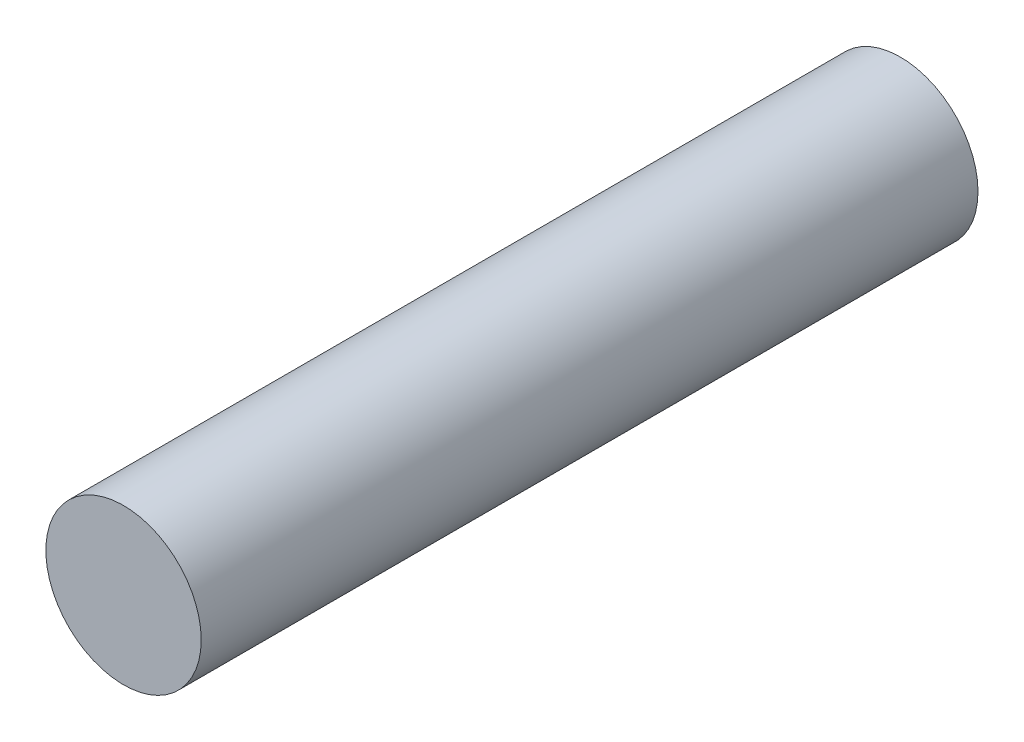
ISO-10303-21;
HEADER;
FILE_DESCRIPTION(('STEP AP214'),'2;1');
FILE_NAME('part.step','',(''),(''),'','','');
FILE_SCHEMA(('AUTOMOTIVE_DESIGN { 1 0 10303 214 1 1 1 1 }'));
ENDSEC;
DATA;
#1=APPLICATION_CONTEXT('core data for automotive mechanical design processes');
#2=APPLICATION_PROTOCOL_DEFINITION('international standard','automotive_design',2000,#1);
#3=PRODUCT_CONTEXT('',#1,'mechanical');
#4=PRODUCT('Part','Part','',(#3));
#5=PRODUCT_RELATED_PRODUCT_CATEGORY('part','',(#4));
#6=PRODUCT_DEFINITION_FORMATION('','',#4);
#7=PRODUCT_DEFINITION_CONTEXT('part definition',#1,'design');
#8=PRODUCT_DEFINITION('design','',#6,#7);
#9=PRODUCT_DEFINITION_SHAPE('','',#8);
#10=(LENGTH_UNIT() NAMED_UNIT(*) SI_UNIT(.MILLI.,.METRE.));
#11=(NAMED_UNIT(*) PLANE_ANGLE_UNIT() SI_UNIT($,.RADIAN.));
#12=(NAMED_UNIT(*) SI_UNIT($,.STERADIAN.) SOLID_ANGLE_UNIT());
#13=UNCERTAINTY_MEASURE_WITH_UNIT(LENGTH_MEASURE(1.E-05),#10,'distance_accuracy_value','');
#14=(GEOMETRIC_REPRESENTATION_CONTEXT(3) GLOBAL_UNCERTAINTY_ASSIGNED_CONTEXT((#13)) GLOBAL_UNIT_ASSIGNED_CONTEXT((#10,
#11,#12)) REPRESENTATION_CONTEXT('',''));
#15=CARTESIAN_POINT('',(0.,0.,0.));
#16=DIRECTION('',(0.,0.,1.));
#17=DIRECTION('',(1.,0.,0.));
#18=AXIS2_PLACEMENT_3D('',#15,#16,#17);
#19=CARTESIAN_POINT('',(0.,0.,2.5));
#20=DIRECTION('',(0.,0.,-1.));
#21=DIRECTION('',(-1.,0.,0.));
#22=AXIS2_PLACEMENT_3D('',#19,#20,#21);
#23=CYLINDRICAL_SURFACE('',#22,0.5);
#24=CARTESIAN_POINT('',(0.,0.,2.5));
#25=DIRECTION('',(0.,0.,1.));
#26=DIRECTION('',(1.,0.,0.));
#27=AXIS2_PLACEMENT_3D('',#24,#25,#26);
#28=CIRCLE('',#27,0.5);
#29=CARTESIAN_POINT('',(0.5,0.,2.5));
#30=VERTEX_POINT('',#29);
#31=EDGE_CURVE('E10',#30,#30,#28,.T.);
#32=ORIENTED_EDGE('',*,*,#31,.F.);
#33=EDGE_LOOP('',(#32));
#34=FACE_BOUND('',#33,.T.);
#35=CARTESIAN_POINT('',(0.,0.,-2.5));
#36=DIRECTION('',(0.,0.,1.));
#37=DIRECTION('',(1.,0.,0.));
#38=AXIS2_PLACEMENT_3D('',#35,#36,#37);
#39=CIRCLE('',#38,0.5);
#40=CARTESIAN_POINT('',(0.5,0.,-2.5));
#41=VERTEX_POINT('',#40);
#42=EDGE_CURVE('E33',#41,#41,#39,.T.);
#43=ORIENTED_EDGE('',*,*,#42,.T.);
#44=EDGE_LOOP('',(#43));
#45=FACE_BOUND('',#44,.T.);
#46=ADVANCED_FACE('F30',(#34,#45),#23,.T.);
#47=CARTESIAN_POINT('',(0.,0.,2.5));
#48=DIRECTION('',(0.,0.,1.));
#49=DIRECTION('',(1.,0.,0.));
#50=AXIS2_PLACEMENT_3D('',#47,#48,#49);
#51=PLANE('',#50);
#52=ORIENTED_EDGE('',*,*,#31,.T.);
#53=EDGE_LOOP('',(#52));
#54=FACE_BOUND('',#53,.T.);
#55=ADVANCED_FACE('F45',(#54),#51,.T.);
#56=CARTESIAN_POINT('',(0.,0.,-2.5));
#57=DIRECTION('',(0.,0.,1.));
#58=DIRECTION('',(1.,0.,0.));
#59=AXIS2_PLACEMENT_3D('',#56,#57,#58);
#60=PLANE('',#59);
#61=ORIENTED_EDGE('',*,*,#42,.F.);
#62=EDGE_LOOP('',(#61));
#63=FACE_BOUND('',#62,.T.);
#64=ADVANCED_FACE('F43',(#63),#60,.F.);
#65=CLOSED_SHELL('',(#46,#55,#64));
#66=MANIFOLD_SOLID_BREP('B2',#65);
#67=ADVANCED_BREP_SHAPE_REPRESENTATION('',(#18,#66),#14);
#68=SHAPE_DEFINITION_REPRESENTATION(#9,#67);
ENDSEC;
END-ISO-10303-21;
